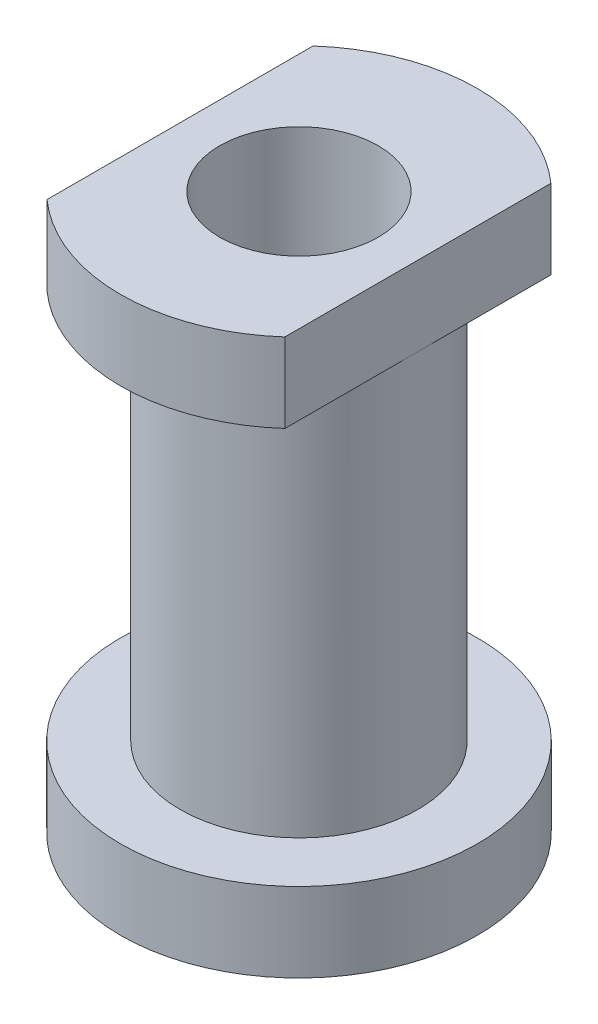
ISO-10303-21;
HEADER;
FILE_DESCRIPTION(('STEP AP214'),'2;1');
FILE_NAME('part.step','',(''),(''),'','','');
FILE_SCHEMA(('AUTOMOTIVE_DESIGN { 1 0 10303 214 1 1 1 1 }'));
ENDSEC;
DATA;
#1=APPLICATION_CONTEXT('core data for automotive mechanical design processes');
#2=APPLICATION_PROTOCOL_DEFINITION('international standard','automotive_design',2000,#1);
#3=PRODUCT_CONTEXT('',#1,'mechanical');
#4=PRODUCT('Part','Part','',(#3));
#5=PRODUCT_RELATED_PRODUCT_CATEGORY('part','',(#4));
#6=PRODUCT_DEFINITION_FORMATION('','',#4);
#7=PRODUCT_DEFINITION_CONTEXT('part definition',#1,'design');
#8=PRODUCT_DEFINITION('design','',#6,#7);
#9=PRODUCT_DEFINITION_SHAPE('','',#8);
#10=(LENGTH_UNIT() NAMED_UNIT(*) SI_UNIT(.MILLI.,.METRE.));
#11=(NAMED_UNIT(*) PLANE_ANGLE_UNIT() SI_UNIT($,.RADIAN.));
#12=(NAMED_UNIT(*) SI_UNIT($,.STERADIAN.) SOLID_ANGLE_UNIT());
#13=UNCERTAINTY_MEASURE_WITH_UNIT(LENGTH_MEASURE(1.E-05),#10,'distance_accuracy_value','');
#14=(GEOMETRIC_REPRESENTATION_CONTEXT(3) GLOBAL_UNCERTAINTY_ASSIGNED_CONTEXT((#13)) GLOBAL_UNIT_ASSIGNED_CONTEXT((#10,
#11,#12)) REPRESENTATION_CONTEXT('',''));
#15=CARTESIAN_POINT('',(0.,0.,0.));
#16=DIRECTION('',(0.,0.,1.));
#17=DIRECTION('',(1.,0.,0.));
#18=AXIS2_PLACEMENT_3D('',#15,#16,#17);
#19=CARTESIAN_POINT('',(0.,70.,0.));
#20=DIRECTION('',(0.,-1.,0.));
#21=DIRECTION('',(0.,0.,-1.));
#22=AXIS2_PLACEMENT_3D('',#19,#20,#21);
#23=CYLINDRICAL_SURFACE('',#22,15.);
#24=CARTESIAN_POINT('',(0.,10.,0.));
#25=DIRECTION('',(0.,1.,0.));
#26=DIRECTION('',(0.,0.,1.));
#27=AXIS2_PLACEMENT_3D('',#24,#25,#26);
#28=CIRCLE('',#27,15.);
#29=CARTESIAN_POINT('',(0.,10.,15.));
#30=VERTEX_POINT('',#29);
#31=EDGE_CURVE('E11',#30,#30,#28,.T.);
#32=ORIENTED_EDGE('',*,*,#31,.T.);
#33=EDGE_LOOP('',(#32));
#34=FACE_BOUND('',#33,.T.);
#35=CARTESIAN_POINT('',(0.,60.,0.));
#36=DIRECTION('',(0.,1.,0.));
#37=DIRECTION('',(0.,0.,1.));
#38=AXIS2_PLACEMENT_3D('',#35,#36,#37);
#39=CIRCLE('',#38,15.);
#40=CARTESIAN_POINT('',(-15.,60.,0.));
#41=VERTEX_POINT('',#40);
#42=CARTESIAN_POINT('',(15.,60.,0.));
#43=VERTEX_POINT('',#42);
#44=EDGE_CURVE('E83',#41,#43,#39,.T.);
#45=ORIENTED_EDGE('',*,*,#44,.F.);
#46=CARTESIAN_POINT('',(0.,60.,0.));
#47=DIRECTION('',(0.,1.,0.));
#48=DIRECTION('',(0.,0.,1.));
#49=AXIS2_PLACEMENT_3D('',#46,#47,#48);
#50=CIRCLE('',#49,15.);
#51=EDGE_CURVE('E77',#43,#41,#50,.T.);
#52=ORIENTED_EDGE('',*,*,#51,.F.);
#53=EDGE_LOOP('',(#45,#52));
#54=FACE_BOUND('',#53,.T.);
#55=ADVANCED_FACE('F35',(#34,#54),#23,.T.);
#56=CARTESIAN_POINT('',(0.,10.,0.));
#57=DIRECTION('',(0.,-1.,0.));
#58=DIRECTION('',(0.,0.,-1.));
#59=AXIS2_PLACEMENT_3D('',#56,#57,#58);
#60=CYLINDRICAL_SURFACE('',#59,22.5);
#61=CARTESIAN_POINT('',(0.,10.,0.));
#62=DIRECTION('',(0.,1.,0.));
#63=DIRECTION('',(0.,0.,1.));
#64=AXIS2_PLACEMENT_3D('',#61,#62,#63);
#65=CIRCLE('',#64,22.5);
#66=CARTESIAN_POINT('',(0.,10.,22.5));
#67=VERTEX_POINT('',#66);
#68=EDGE_CURVE('E45',#67,#67,#65,.T.);
#69=ORIENTED_EDGE('',*,*,#68,.F.);
#70=EDGE_LOOP('',(#69));
#71=FACE_BOUND('',#70,.T.);
#72=CARTESIAN_POINT('',(0.,0.,0.));
#73=DIRECTION('',(0.,1.,0.));
#74=DIRECTION('',(0.,0.,1.));
#75=AXIS2_PLACEMENT_3D('',#72,#73,#74);
#76=CIRCLE('',#75,22.5);
#77=CARTESIAN_POINT('',(0.,0.,22.5));
#78=VERTEX_POINT('',#77);
#79=EDGE_CURVE('E39',#78,#78,#76,.T.);
#80=ORIENTED_EDGE('',*,*,#79,.T.);
#81=EDGE_LOOP('',(#80));
#82=FACE_BOUND('',#81,.T.);
#83=ADVANCED_FACE('F37',(#71,#82),#60,.T.);
#84=CARTESIAN_POINT('',(0.,10.,0.));
#85=DIRECTION('',(0.,1.,0.));
#86=DIRECTION('',(0.,0.,1.));
#87=AXIS2_PLACEMENT_3D('',#84,#85,#86);
#88=PLANE('',#87);
#89=ORIENTED_EDGE('',*,*,#68,.T.);
#90=EDGE_LOOP('',(#89));
#91=FACE_BOUND('',#90,.T.);
#92=ORIENTED_EDGE('',*,*,#31,.F.);
#93=EDGE_LOOP('',(#92));
#94=FACE_BOUND('',#93,.T.);
#95=ADVANCED_FACE('F144',(#91,#94),#88,.T.);
#96=CARTESIAN_POINT('',(0.,0.,0.));
#97=DIRECTION('',(0.,1.,0.));
#98=DIRECTION('',(0.,0.,1.));
#99=AXIS2_PLACEMENT_3D('',#96,#97,#98);
#100=PLANE('',#99);
#101=ORIENTED_EDGE('',*,*,#79,.F.);
#102=EDGE_LOOP('',(#101));
#103=FACE_BOUND('',#102,.T.);
#104=CARTESIAN_POINT('',(0.,0.,0.));
#105=DIRECTION('',(0.,1.,0.));
#106=DIRECTION('',(0.,0.,1.));
#107=AXIS2_PLACEMENT_3D('',#104,#105,#106);
#108=CIRCLE('',#107,10.);
#109=CARTESIAN_POINT('',(0.,0.,10.));
#110=VERTEX_POINT('',#109);
#111=EDGE_CURVE('E127',#110,#110,#108,.T.);
#112=ORIENTED_EDGE('',*,*,#111,.T.);
#113=EDGE_LOOP('',(#112));
#114=FACE_BOUND('',#113,.T.);
#115=ADVANCED_FACE('F140',(#103,#114),#100,.F.);
#116=CARTESIAN_POINT('',(0.,70.,0.));
#117=DIRECTION('',(0.,-1.,0.));
#118=DIRECTION('',(0.,0.,-1.));
#119=AXIS2_PLACEMENT_3D('',#116,#117,#118);
#120=CYLINDRICAL_SURFACE('',#119,10.);
#121=CARTESIAN_POINT('',(0.,70.,0.));
#122=DIRECTION('',(0.,1.,0.));
#123=DIRECTION('',(0.,0.,1.));
#124=AXIS2_PLACEMENT_3D('',#121,#122,#123);
#125=CIRCLE('',#124,10.);
#126=CARTESIAN_POINT('',(0.,70.,10.));
#127=VERTEX_POINT('',#126);
#128=EDGE_CURVE('E128',#127,#127,#125,.T.);
#129=ORIENTED_EDGE('',*,*,#128,.T.);
#130=EDGE_LOOP('',(#129));
#131=FACE_BOUND('',#130,.T.);
#132=ORIENTED_EDGE('',*,*,#111,.F.);
#133=EDGE_LOOP('',(#132));
#134=FACE_BOUND('',#133,.T.);
#135=ADVANCED_FACE('F143',(#131,#134),#120,.F.);
#136=CARTESIAN_POINT('',(0.,70.,0.));
#137=DIRECTION('',(0.,1.,0.));
#138=DIRECTION('',(0.,0.,1.));
#139=AXIS2_PLACEMENT_3D('',#136,#137,#138);
#140=PLANE('',#139);
#141=ORIENTED_EDGE('',*,*,#128,.F.);
#142=EDGE_LOOP('',(#141));
#143=FACE_BOUND('',#142,.T.);
#144=DIRECTION('',(0.,0.,-1.));
#145=VECTOR('',#144,1.);
#146=CARTESIAN_POINT('',(-15.,70.,0.));
#147=LINE('',#146,#145);
#148=CARTESIAN_POINT('',(-15.,70.,16.7705098312484));
#149=VERTEX_POINT('',#148);
#150=CARTESIAN_POINT('',(-15.,70.,-16.7705098312484));
#151=VERTEX_POINT('',#150);
#152=EDGE_CURVE('E120',#149,#151,#147,.T.);
#153=ORIENTED_EDGE('',*,*,#152,.F.);
#154=CARTESIAN_POINT('',(0.,70.,0.));
#155=DIRECTION('',(0.,1.,0.));
#156=DIRECTION('',(0.,0.,1.));
#157=AXIS2_PLACEMENT_3D('',#154,#155,#156);
#158=CIRCLE('',#157,22.5);
#159=CARTESIAN_POINT('',(15.,70.,16.7705098312484));
#160=VERTEX_POINT('',#159);
#161=EDGE_CURVE('E108',#149,#160,#158,.T.);
#162=ORIENTED_EDGE('',*,*,#161,.T.);
#163=DIRECTION('',(0.,0.,-1.));
#164=VECTOR('',#163,1.);
#165=CARTESIAN_POINT('',(15.,70.,0.));
#166=LINE('',#165,#164);
#167=CARTESIAN_POINT('',(15.,70.,-16.7705098312484));
#168=VERTEX_POINT('',#167);
#169=EDGE_CURVE('E89',#160,#168,#166,.T.);
#170=ORIENTED_EDGE('',*,*,#169,.T.);
#171=CARTESIAN_POINT('',(0.,70.,0.));
#172=DIRECTION('',(0.,1.,0.));
#173=DIRECTION('',(0.,0.,1.));
#174=AXIS2_PLACEMENT_3D('',#171,#172,#173);
#175=CIRCLE('',#174,22.5);
#176=EDGE_CURVE('E53',#168,#151,#175,.T.);
#177=ORIENTED_EDGE('',*,*,#176,.T.);
#178=EDGE_LOOP('',(#153,#162,#170,#177));
#179=FACE_BOUND('',#178,.T.);
#180=ADVANCED_FACE('F148',(#143,#179),#140,.T.);
#181=CARTESIAN_POINT('',(15.,70.,0.));
#182=DIRECTION('',(-1.,0.,0.));
#183=DIRECTION('',(0.,0.,1.));
#184=AXIS2_PLACEMENT_3D('',#181,#182,#183);
#185=PLANE('',#184);
#186=DIRECTION('',(0.,0.,-1.));
#187=VECTOR('',#186,1.);
#188=CARTESIAN_POINT('',(15.,60.,0.));
#189=LINE('',#188,#187);
#190=CARTESIAN_POINT('',(15.,60.,-16.7705098312484));
#191=VERTEX_POINT('',#190);
#192=EDGE_CURVE('E72',#43,#191,#189,.T.);
#193=ORIENTED_EDGE('',*,*,#192,.T.);
#194=DIRECTION('',(0.,-1.,0.));
#195=VECTOR('',#194,1.);
#196=CARTESIAN_POINT('',(15.,70.,-16.7705098312484));
#197=LINE('',#196,#195);
#198=EDGE_CURVE('E125',#168,#191,#197,.T.);
#199=ORIENTED_EDGE('',*,*,#198,.F.);
#200=ORIENTED_EDGE('',*,*,#169,.F.);
#201=DIRECTION('',(0.,-1.,0.));
#202=VECTOR('',#201,1.);
#203=CARTESIAN_POINT('',(15.,70.,16.7705098312484));
#204=LINE('',#203,#202);
#205=CARTESIAN_POINT('',(15.,60.,16.7705098312484));
#206=VERTEX_POINT('',#205);
#207=EDGE_CURVE('E99',#160,#206,#204,.T.);
#208=ORIENTED_EDGE('',*,*,#207,.T.);
#209=DIRECTION('',(0.,0.,-1.));
#210=VECTOR('',#209,1.);
#211=CARTESIAN_POINT('',(15.,60.,0.));
#212=LINE('',#211,#210);
#213=EDGE_CURVE('E94',#206,#43,#212,.T.);
#214=ORIENTED_EDGE('',*,*,#213,.T.);
#215=EDGE_LOOP('',(#193,#199,#200,#208,#214));
#216=FACE_BOUND('',#215,.T.);
#217=ADVANCED_FACE('F95',(#216),#185,.F.);
#218=CARTESIAN_POINT('',(0.,70.,0.));
#219=DIRECTION('',(0.,-1.,0.));
#220=DIRECTION('',(0.,0.,-1.));
#221=AXIS2_PLACEMENT_3D('',#218,#219,#220);
#222=CYLINDRICAL_SURFACE('',#221,22.5);
#223=CARTESIAN_POINT('',(0.,60.,0.));
#224=DIRECTION('',(0.,1.,0.));
#225=DIRECTION('',(0.,0.,1.));
#226=AXIS2_PLACEMENT_3D('',#223,#224,#225);
#227=CIRCLE('',#226,22.5);
#228=CARTESIAN_POINT('',(-15.,60.,-16.7705098312484));
#229=VERTEX_POINT('',#228);
#230=EDGE_CURVE('E78',#191,#229,#227,.T.);
#231=ORIENTED_EDGE('',*,*,#230,.T.);
#232=DIRECTION('',(0.,-1.,0.));
#233=VECTOR('',#232,1.);
#234=CARTESIAN_POINT('',(-15.,70.,-16.7705098312484));
#235=LINE('',#234,#233);
#236=EDGE_CURVE('E66',#151,#229,#235,.T.);
#237=ORIENTED_EDGE('',*,*,#236,.F.);
#238=ORIENTED_EDGE('',*,*,#176,.F.);
#239=ORIENTED_EDGE('',*,*,#198,.T.);
#240=EDGE_LOOP('',(#231,#237,#238,#239));
#241=FACE_BOUND('',#240,.T.);
#242=ADVANCED_FACE('F167',(#241),#222,.T.);
#243=CARTESIAN_POINT('',(-15.,70.,0.));
#244=DIRECTION('',(-1.,0.,0.));
#245=DIRECTION('',(0.,0.,1.));
#246=AXIS2_PLACEMENT_3D('',#243,#244,#245);
#247=PLANE('',#246);
#248=DIRECTION('',(0.,0.,-1.));
#249=VECTOR('',#248,1.);
#250=CARTESIAN_POINT('',(-15.,60.,0.));
#251=LINE('',#250,#249);
#252=EDGE_CURVE('E90',#41,#229,#251,.T.);
#253=ORIENTED_EDGE('',*,*,#252,.F.);
#254=DIRECTION('',(0.,0.,-1.));
#255=VECTOR('',#254,1.);
#256=CARTESIAN_POINT('',(-15.,60.,0.));
#257=LINE('',#256,#255);
#258=CARTESIAN_POINT('',(-15.,60.,16.7705098312484));
#259=VERTEX_POINT('',#258);
#260=EDGE_CURVE('E106',#259,#41,#257,.T.);
#261=ORIENTED_EDGE('',*,*,#260,.F.);
#262=DIRECTION('',(0.,-1.,0.));
#263=VECTOR('',#262,1.);
#264=CARTESIAN_POINT('',(-15.,70.,16.7705098312484));
#265=LINE('',#264,#263);
#266=EDGE_CURVE('E102',#149,#259,#265,.T.);
#267=ORIENTED_EDGE('',*,*,#266,.F.);
#268=ORIENTED_EDGE('',*,*,#152,.T.);
#269=ORIENTED_EDGE('',*,*,#236,.T.);
#270=EDGE_LOOP('',(#253,#261,#267,#268,#269));
#271=FACE_BOUND('',#270,.T.);
#272=ADVANCED_FACE('F170',(#271),#247,.T.);
#273=CARTESIAN_POINT('',(0.,60.,0.));
#274=DIRECTION('',(0.,1.,0.));
#275=DIRECTION('',(0.,0.,1.));
#276=AXIS2_PLACEMENT_3D('',#273,#274,#275);
#277=PLANE('',#276);
#278=ORIENTED_EDGE('',*,*,#192,.F.);
#279=ORIENTED_EDGE('',*,*,#51,.T.);
#280=ORIENTED_EDGE('',*,*,#252,.T.);
#281=ORIENTED_EDGE('',*,*,#230,.F.);
#282=EDGE_LOOP('',(#278,#279,#280,#281));
#283=FACE_BOUND('',#282,.T.);
#284=ADVANCED_FACE('F74',(#283),#277,.F.);
#285=CARTESIAN_POINT('',(0.,70.,0.));
#286=DIRECTION('',(0.,-1.,0.));
#287=DIRECTION('',(0.,0.,-1.));
#288=AXIS2_PLACEMENT_3D('',#285,#286,#287);
#289=CYLINDRICAL_SURFACE('',#288,22.5);
#290=CARTESIAN_POINT('',(0.,60.,0.));
#291=DIRECTION('',(0.,1.,0.));
#292=DIRECTION('',(0.,0.,1.));
#293=AXIS2_PLACEMENT_3D('',#290,#291,#292);
#294=CIRCLE('',#293,22.5);
#295=EDGE_CURVE('E113',#259,#206,#294,.T.);
#296=ORIENTED_EDGE('',*,*,#295,.T.);
#297=ORIENTED_EDGE('',*,*,#207,.F.);
#298=ORIENTED_EDGE('',*,*,#161,.F.);
#299=ORIENTED_EDGE('',*,*,#266,.T.);
#300=EDGE_LOOP('',(#296,#297,#298,#299));
#301=FACE_BOUND('',#300,.T.);
#302=ADVANCED_FACE('F176',(#301),#289,.T.);
#303=CARTESIAN_POINT('',(0.,60.,0.));
#304=DIRECTION('',(0.,1.,0.));
#305=DIRECTION('',(0.,0.,1.));
#306=AXIS2_PLACEMENT_3D('',#303,#304,#305);
#307=PLANE('',#306);
#308=ORIENTED_EDGE('',*,*,#260,.T.);
#309=ORIENTED_EDGE('',*,*,#44,.T.);
#310=ORIENTED_EDGE('',*,*,#213,.F.);
#311=ORIENTED_EDGE('',*,*,#295,.F.);
#312=EDGE_LOOP('',(#308,#309,#310,#311));
#313=FACE_BOUND('',#312,.T.);
#314=ADVANCED_FACE('F104',(#313),#307,.F.);
#315=CLOSED_SHELL('',(#55,#83,#95,#115,#135,#180,#217,#242,#272,#284,#302,#314));
#316=MANIFOLD_SOLID_BREP('B2',#315);
#317=ADVANCED_BREP_SHAPE_REPRESENTATION('',(#18,#316),#14);
#318=SHAPE_DEFINITION_REPRESENTATION(#9,#317);
ENDSEC;
END-ISO-10303-21;
